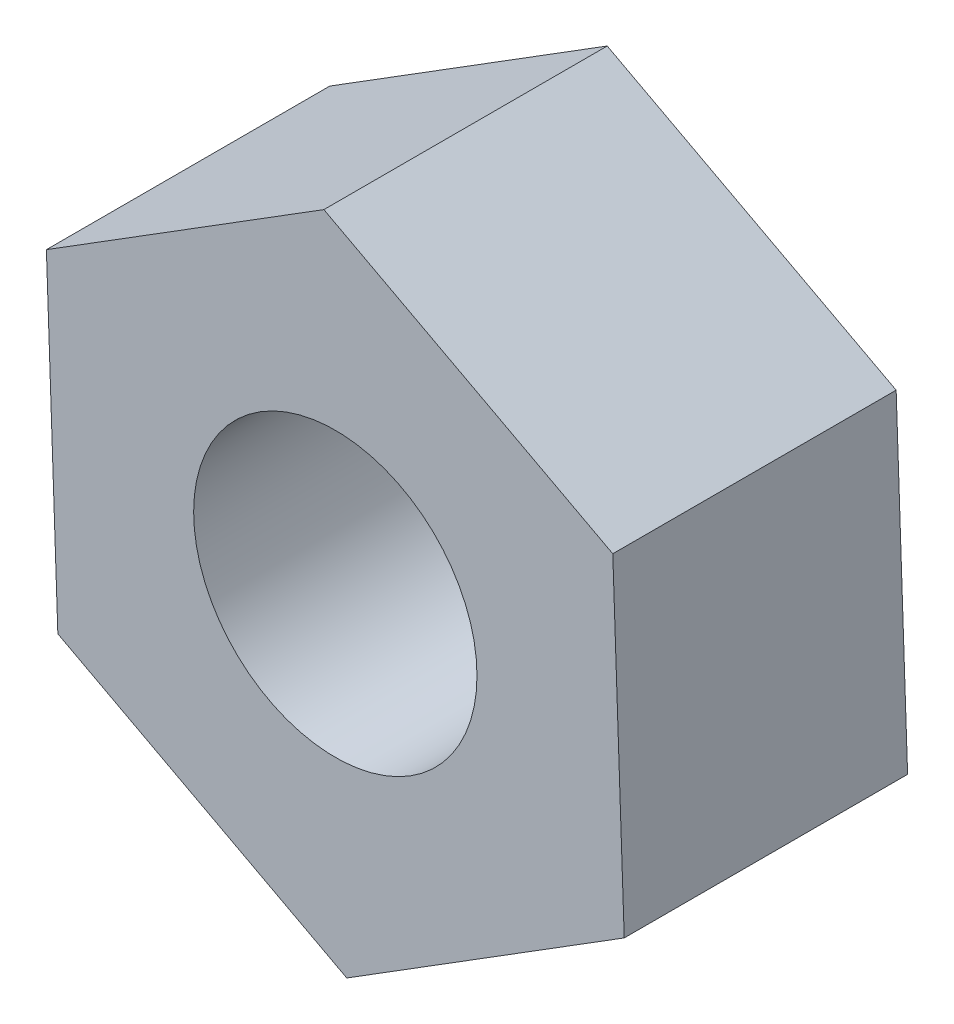
ISO-10303-21;
HEADER;
FILE_DESCRIPTION(('STEP AP214'),'2;1');
FILE_NAME('part.step','',(''),(''),'','','');
FILE_SCHEMA(('AUTOMOTIVE_DESIGN { 1 0 10303 214 1 1 1 1 }'));
ENDSEC;
DATA;
#1=APPLICATION_CONTEXT('core data for automotive mechanical design processes');
#2=APPLICATION_PROTOCOL_DEFINITION('international standard','automotive_design',2000,#1);
#3=PRODUCT_CONTEXT('',#1,'mechanical');
#4=PRODUCT('Part','Part','',(#3));
#5=PRODUCT_RELATED_PRODUCT_CATEGORY('part','',(#4));
#6=PRODUCT_DEFINITION_FORMATION('','',#4);
#7=PRODUCT_DEFINITION_CONTEXT('part definition',#1,'design');
#8=PRODUCT_DEFINITION('design','',#6,#7);
#9=PRODUCT_DEFINITION_SHAPE('','',#8);
#10=(LENGTH_UNIT() NAMED_UNIT(*) SI_UNIT(.MILLI.,.METRE.));
#11=(NAMED_UNIT(*) PLANE_ANGLE_UNIT() SI_UNIT($,.RADIAN.));
#12=(NAMED_UNIT(*) SI_UNIT($,.STERADIAN.) SOLID_ANGLE_UNIT());
#13=UNCERTAINTY_MEASURE_WITH_UNIT(LENGTH_MEASURE(1.E-05),#10,'distance_accuracy_value','');
#14=(GEOMETRIC_REPRESENTATION_CONTEXT(3) GLOBAL_UNCERTAINTY_ASSIGNED_CONTEXT((#13)) GLOBAL_UNIT_ASSIGNED_CONTEXT((#10,
#11,#12)) REPRESENTATION_CONTEXT('',''));
#15=CARTESIAN_POINT('',(0.,0.,0.));
#16=DIRECTION('',(0.,0.,1.));
#17=DIRECTION('',(1.,0.,0.));
#18=AXIS2_PLACEMENT_3D('',#15,#16,#17);
#19=CARTESIAN_POINT('',(0.,0.,4.));
#20=DIRECTION('',(0.,0.,1.));
#21=DIRECTION('',(1.,0.,0.));
#22=AXIS2_PLACEMENT_3D('',#19,#20,#21);
#23=PLANE('',#22);
#24=DIRECTION('',(-0.034997051242381,0.999387415572329,0.));
#25=VECTOR('',#24,1.);
#26=CARTESIAN_POINT('',(4.07837189011184,-2.16799816865211,4.));
#27=LINE('',#26,#25);
#28=CARTESIAN_POINT('',(4.07837189011184,-2.16799816865211,4.));
#29=VERTEX_POINT('',#28);
#30=CARTESIAN_POINT('',(3.91672743446679,2.44797457859116,4.));
#31=VERTEX_POINT('',#30);
#32=EDGE_CURVE('E133',#29,#31,#27,.T.);
#33=ORIENTED_EDGE('',*,*,#32,.T.);
#34=DIRECTION('',(-0.882993415729303,0.469385372352716,0.));
#35=VECTOR('',#34,1.);
#36=CARTESIAN_POINT('',(3.91672743446679,2.44797457859116,4.));
#37=LINE('',#36,#35);
#38=CARTESIAN_POINT('',(-0.161644455645054,4.61597274724327,4.));
#39=VERTEX_POINT('',#38);
#40=EDGE_CURVE('E91',#31,#39,#37,.T.);
#41=ORIENTED_EDGE('',*,*,#40,.T.);
#42=DIRECTION('',(-0.847996364486922,-0.530002043219613,0.));
#43=VECTOR('',#42,1.);
#44=CARTESIAN_POINT('',(-0.161644455645054,4.61597274724327,4.));
#45=LINE('',#44,#43);
#46=CARTESIAN_POINT('',(-4.07837189011184,2.16799816865211,4.));
#47=VERTEX_POINT('',#46);
#48=EDGE_CURVE('E104',#39,#47,#45,.T.);
#49=ORIENTED_EDGE('',*,*,#48,.T.);
#50=DIRECTION('',(0.0349970512423812,-0.999387415572329,0.));
#51=VECTOR('',#50,1.);
#52=CARTESIAN_POINT('',(-4.07837189011184,2.16799816865211,4.));
#53=LINE('',#52,#51);
#54=CARTESIAN_POINT('',(-3.91672743446679,-2.44797457859116,4.));
#55=VERTEX_POINT('',#54);
#56=EDGE_CURVE('E98',#47,#55,#53,.T.);
#57=ORIENTED_EDGE('',*,*,#56,.T.);
#58=DIRECTION('',(0.882993415729303,-0.469385372352716,0.));
#59=VECTOR('',#58,1.);
#60=CARTESIAN_POINT('',(-3.91672743446679,-2.44797457859116,4.));
#61=LINE('',#60,#59);
#62=CARTESIAN_POINT('',(0.161644455645055,-4.61597274724327,4.));
#63=VERTEX_POINT('',#62);
#64=EDGE_CURVE('E102',#55,#63,#61,.T.);
#65=ORIENTED_EDGE('',*,*,#64,.T.);
#66=DIRECTION('',(0.847996364486922,0.530002043219612,0.));
#67=VECTOR('',#66,1.);
#68=CARTESIAN_POINT('',(0.161644455645055,-4.61597274724327,4.));
#69=LINE('',#68,#67);
#70=EDGE_CURVE('E54',#63,#29,#69,.T.);
#71=ORIENTED_EDGE('',*,*,#70,.T.);
#72=EDGE_LOOP('',(#33,#41,#49,#57,#65,#71));
#73=FACE_BOUND('',#72,.T.);
#74=CARTESIAN_POINT('',(0.,0.,4.));
#75=DIRECTION('',(0.,0.,1.));
#76=DIRECTION('',(1.,0.,0.));
#77=AXIS2_PLACEMENT_3D('',#74,#75,#76);
#78=CIRCLE('',#77,2.);
#79=CARTESIAN_POINT('',(2.,0.,4.));
#80=VERTEX_POINT('',#79);
#81=EDGE_CURVE('E126',#80,#80,#78,.T.);
#82=ORIENTED_EDGE('',*,*,#81,.F.);
#83=EDGE_LOOP('',(#82));
#84=FACE_BOUND('',#83,.T.);
#85=ADVANCED_FACE('F37',(#73,#84),#23,.T.);
#86=CARTESIAN_POINT('',(0.,0.,0.));
#87=DIRECTION('',(0.,0.,1.));
#88=DIRECTION('',(1.,0.,0.));
#89=AXIS2_PLACEMENT_3D('',#86,#87,#88);
#90=PLANE('',#89);
#91=DIRECTION('',(-0.034997051242381,0.999387415572329,0.));
#92=VECTOR('',#91,1.);
#93=CARTESIAN_POINT('',(4.07837189011184,-2.16799816865211,0.));
#94=LINE('',#93,#92);
#95=CARTESIAN_POINT('',(4.07837189011184,-2.16799816865211,0.));
#96=VERTEX_POINT('',#95);
#97=CARTESIAN_POINT('',(3.91672743446679,2.44797457859116,0.));
#98=VERTEX_POINT('',#97);
#99=EDGE_CURVE('E122',#96,#98,#94,.T.);
#100=ORIENTED_EDGE('',*,*,#99,.F.);
#101=DIRECTION('',(0.847996364486922,0.530002043219612,0.));
#102=VECTOR('',#101,1.);
#103=CARTESIAN_POINT('',(0.161644455645055,-4.61597274724327,0.));
#104=LINE('',#103,#102);
#105=CARTESIAN_POINT('',(0.161644455645055,-4.61597274724327,0.));
#106=VERTEX_POINT('',#105);
#107=EDGE_CURVE('E83',#106,#96,#104,.T.);
#108=ORIENTED_EDGE('',*,*,#107,.F.);
#109=DIRECTION('',(0.882993415729303,-0.469385372352716,0.));
#110=VECTOR('',#109,1.);
#111=CARTESIAN_POINT('',(-3.91672743446679,-2.44797457859116,0.));
#112=LINE('',#111,#110);
#113=CARTESIAN_POINT('',(-3.91672743446679,-2.44797457859116,0.));
#114=VERTEX_POINT('',#113);
#115=EDGE_CURVE('E77',#114,#106,#112,.T.);
#116=ORIENTED_EDGE('',*,*,#115,.F.);
#117=DIRECTION('',(0.0349970512423812,-0.999387415572329,0.));
#118=VECTOR('',#117,1.);
#119=CARTESIAN_POINT('',(-4.07837189011184,2.16799816865211,0.));
#120=LINE('',#119,#118);
#121=CARTESIAN_POINT('',(-4.07837189011184,2.16799816865211,0.));
#122=VERTEX_POINT('',#121);
#123=EDGE_CURVE('E112',#122,#114,#120,.T.);
#124=ORIENTED_EDGE('',*,*,#123,.F.);
#125=DIRECTION('',(-0.847996364486922,-0.530002043219613,0.));
#126=VECTOR('',#125,1.);
#127=CARTESIAN_POINT('',(-0.161644455645054,4.61597274724327,0.));
#128=LINE('',#127,#126);
#129=CARTESIAN_POINT('',(-0.161644455645054,4.61597274724327,0.));
#130=VERTEX_POINT('',#129);
#131=EDGE_CURVE('E128',#130,#122,#128,.T.);
#132=ORIENTED_EDGE('',*,*,#131,.F.);
#133=DIRECTION('',(-0.882993415729303,0.469385372352716,0.));
#134=VECTOR('',#133,1.);
#135=CARTESIAN_POINT('',(3.91672743446679,2.44797457859116,0.));
#136=LINE('',#135,#134);
#137=EDGE_CURVE('E125',#98,#130,#136,.T.);
#138=ORIENTED_EDGE('',*,*,#137,.F.);
#139=EDGE_LOOP('',(#100,#108,#116,#124,#132,#138));
#140=FACE_BOUND('',#139,.T.);
#141=CARTESIAN_POINT('',(0.,0.,0.));
#142=DIRECTION('',(0.,0.,1.));
#143=DIRECTION('',(1.,0.,0.));
#144=AXIS2_PLACEMENT_3D('',#141,#142,#143);
#145=CIRCLE('',#144,2.);
#146=CARTESIAN_POINT('',(2.,0.,0.));
#147=VERTEX_POINT('',#146);
#148=EDGE_CURVE('E228',#147,#147,#145,.T.);
#149=ORIENTED_EDGE('',*,*,#148,.T.);
#150=EDGE_LOOP('',(#149));
#151=FACE_BOUND('',#150,.T.);
#152=ADVANCED_FACE('F142',(#140,#151),#90,.F.);
#153=CARTESIAN_POINT('',(4.07837189011184,-2.16799816865211,4.));
#154=DIRECTION('',(-0.999387415572329,-0.034997051242381,0.));
#155=DIRECTION('',(0.034997051242381,-0.999387415572329,0.));
#156=AXIS2_PLACEMENT_3D('',#153,#154,#155);
#157=PLANE('',#156);
#158=ORIENTED_EDGE('',*,*,#99,.T.);
#159=DIRECTION('',(0.,0.,-1.));
#160=VECTOR('',#159,1.);
#161=CARTESIAN_POINT('',(3.91672743446679,2.44797457859116,4.));
#162=LINE('',#161,#160);
#163=EDGE_CURVE('E11',#31,#98,#162,.T.);
#164=ORIENTED_EDGE('',*,*,#163,.F.);
#165=ORIENTED_EDGE('',*,*,#32,.F.);
#166=DIRECTION('',(0.,0.,-1.));
#167=VECTOR('',#166,1.);
#168=CARTESIAN_POINT('',(4.07837189011184,-2.16799816865211,4.));
#169=LINE('',#168,#167);
#170=EDGE_CURVE('E118',#29,#96,#169,.T.);
#171=ORIENTED_EDGE('',*,*,#170,.T.);
#172=EDGE_LOOP('',(#158,#164,#165,#171));
#173=FACE_BOUND('',#172,.T.);
#174=ADVANCED_FACE('F39',(#173),#157,.F.);
#175=CARTESIAN_POINT('',(3.91672743446679,2.44797457859116,4.));
#176=DIRECTION('',(-0.469385372352717,-0.882993415729303,0.));
#177=DIRECTION('',(0.882993415729303,-0.469385372352717,0.));
#178=AXIS2_PLACEMENT_3D('',#175,#176,#177);
#179=PLANE('',#178);
#180=ORIENTED_EDGE('',*,*,#137,.T.);
#181=DIRECTION('',(0.,0.,-1.));
#182=VECTOR('',#181,1.);
#183=CARTESIAN_POINT('',(-0.161644455645054,4.61597274724327,4.));
#184=LINE('',#183,#182);
#185=EDGE_CURVE('E46',#39,#130,#184,.T.);
#186=ORIENTED_EDGE('',*,*,#185,.F.);
#187=ORIENTED_EDGE('',*,*,#40,.F.);
#188=ORIENTED_EDGE('',*,*,#163,.T.);
#189=EDGE_LOOP('',(#180,#186,#187,#188));
#190=FACE_BOUND('',#189,.T.);
#191=ADVANCED_FACE('F167',(#190),#179,.F.);
#192=CARTESIAN_POINT('',(-0.161644455645054,4.61597274724327,4.));
#193=DIRECTION('',(0.530002043219613,-0.847996364486922,0.));
#194=DIRECTION('',(0.847996364486922,0.530002043219613,0.));
#195=AXIS2_PLACEMENT_3D('',#192,#193,#194);
#196=PLANE('',#195);
#197=ORIENTED_EDGE('',*,*,#131,.T.);
#198=DIRECTION('',(0.,0.,-1.));
#199=VECTOR('',#198,1.);
#200=CARTESIAN_POINT('',(-4.07837189011184,2.16799816865211,4.));
#201=LINE('',#200,#199);
#202=EDGE_CURVE('E113',#47,#122,#201,.T.);
#203=ORIENTED_EDGE('',*,*,#202,.F.);
#204=ORIENTED_EDGE('',*,*,#48,.F.);
#205=ORIENTED_EDGE('',*,*,#185,.T.);
#206=EDGE_LOOP('',(#197,#203,#204,#205));
#207=FACE_BOUND('',#206,.T.);
#208=ADVANCED_FACE('F139',(#207),#196,.F.);
#209=CARTESIAN_POINT('',(-4.07837189011184,2.16799816865211,4.));
#210=DIRECTION('',(0.999387415572329,0.0349970512423812,0.));
#211=DIRECTION('',(-0.0349970512423812,0.999387415572329,0.));
#212=AXIS2_PLACEMENT_3D('',#209,#210,#211);
#213=PLANE('',#212);
#214=ORIENTED_EDGE('',*,*,#123,.T.);
#215=DIRECTION('',(0.,0.,-1.));
#216=VECTOR('',#215,1.);
#217=CARTESIAN_POINT('',(-3.91672743446679,-2.44797457859116,4.));
#218=LINE('',#217,#216);
#219=EDGE_CURVE('E109',#55,#114,#218,.T.);
#220=ORIENTED_EDGE('',*,*,#219,.F.);
#221=ORIENTED_EDGE('',*,*,#56,.F.);
#222=ORIENTED_EDGE('',*,*,#202,.T.);
#223=EDGE_LOOP('',(#214,#220,#221,#222));
#224=FACE_BOUND('',#223,.T.);
#225=ADVANCED_FACE('F110',(#224),#213,.F.);
#226=CARTESIAN_POINT('',(-3.91672743446679,-2.44797457859116,4.));
#227=DIRECTION('',(0.469385372352716,0.882993415729303,0.));
#228=DIRECTION('',(-0.882993415729303,0.469385372352716,0.));
#229=AXIS2_PLACEMENT_3D('',#226,#227,#228);
#230=PLANE('',#229);
#231=ORIENTED_EDGE('',*,*,#115,.T.);
#232=DIRECTION('',(0.,0.,-1.));
#233=VECTOR('',#232,1.);
#234=CARTESIAN_POINT('',(0.161644455645055,-4.61597274724327,4.));
#235=LINE('',#234,#233);
#236=EDGE_CURVE('E114',#63,#106,#235,.T.);
#237=ORIENTED_EDGE('',*,*,#236,.F.);
#238=ORIENTED_EDGE('',*,*,#64,.F.);
#239=ORIENTED_EDGE('',*,*,#219,.T.);
#240=EDGE_LOOP('',(#231,#237,#238,#239));
#241=FACE_BOUND('',#240,.T.);
#242=ADVANCED_FACE('F116',(#241),#230,.F.);
#243=CARTESIAN_POINT('',(0.161644455645055,-4.61597274724327,4.));
#244=DIRECTION('',(-0.530002043219613,0.847996364486922,0.));
#245=DIRECTION('',(-0.847996364486922,-0.530002043219612,0.));
#246=AXIS2_PLACEMENT_3D('',#243,#244,#245);
#247=PLANE('',#246);
#248=ORIENTED_EDGE('',*,*,#107,.T.);
#249=ORIENTED_EDGE('',*,*,#170,.F.);
#250=ORIENTED_EDGE('',*,*,#70,.F.);
#251=ORIENTED_EDGE('',*,*,#236,.T.);
#252=EDGE_LOOP('',(#248,#249,#250,#251));
#253=FACE_BOUND('',#252,.T.);
#254=ADVANCED_FACE('F147',(#253),#247,.F.);
#255=CARTESIAN_POINT('',(0.,0.,4.));
#256=DIRECTION('',(0.,0.,-1.));
#257=DIRECTION('',(-1.,0.,0.));
#258=AXIS2_PLACEMENT_3D('',#255,#256,#257);
#259=CYLINDRICAL_SURFACE('',#258,2.);
#260=ORIENTED_EDGE('',*,*,#81,.T.);
#261=EDGE_LOOP('',(#260));
#262=FACE_BOUND('',#261,.T.);
#263=ORIENTED_EDGE('',*,*,#148,.F.);
#264=EDGE_LOOP('',(#263));
#265=FACE_BOUND('',#264,.T.);
#266=ADVANCED_FACE('F149',(#262,#265),#259,.F.);
#267=CLOSED_SHELL('',(#85,#152,#174,#191,#208,#225,#242,#254,#266));
#268=MANIFOLD_SOLID_BREP('B2',#267);
#269=ADVANCED_BREP_SHAPE_REPRESENTATION('',(#18,#268),#14);
#270=SHAPE_DEFINITION_REPRESENTATION(#9,#269);
ENDSEC;
END-ISO-10303-21;
